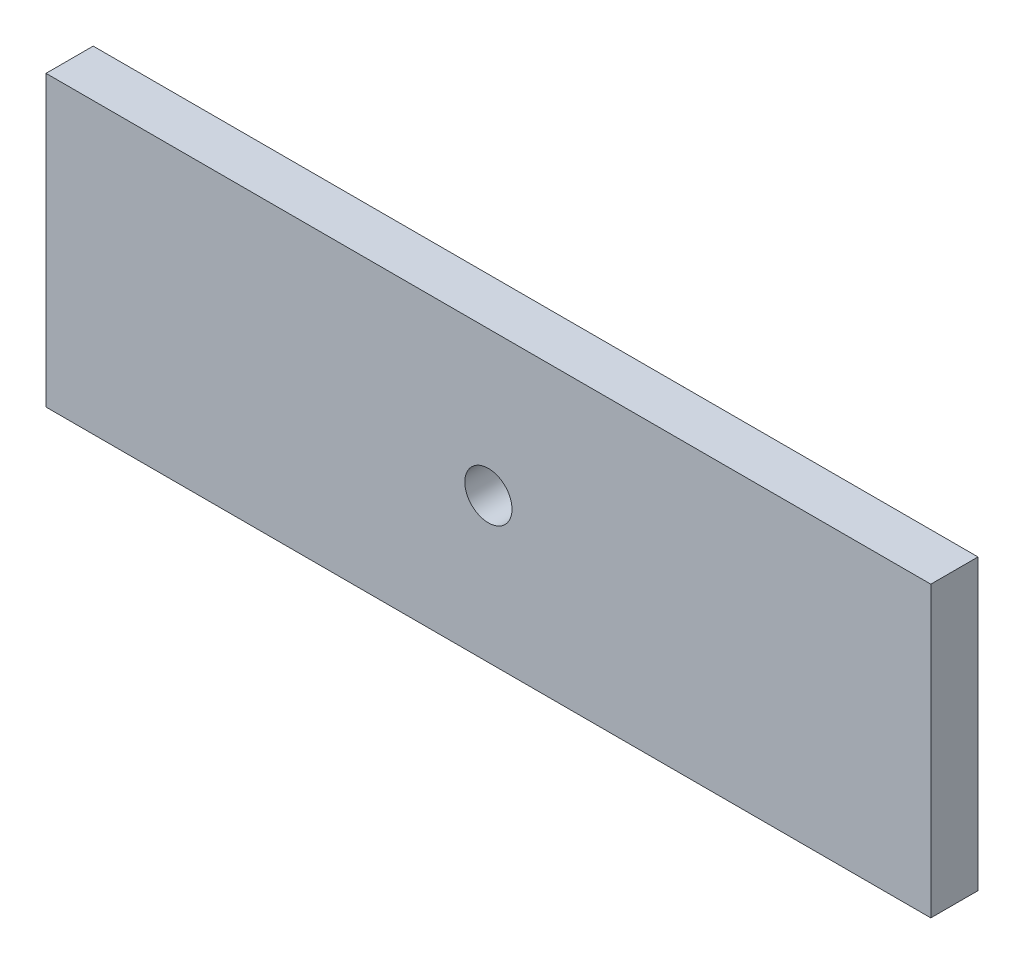
ISO-10303-21;
HEADER;
FILE_DESCRIPTION(('STEP AP214'),'2;1');
FILE_NAME('part.step','',(''),(''),'','','');
FILE_SCHEMA(('AUTOMOTIVE_DESIGN { 1 0 10303 214 1 1 1 1 }'));
ENDSEC;
DATA;
#1=APPLICATION_CONTEXT('core data for automotive mechanical design processes');
#2=APPLICATION_PROTOCOL_DEFINITION('international standard','automotive_design',2000,#1);
#3=PRODUCT_CONTEXT('',#1,'mechanical');
#4=PRODUCT('Part','Part','',(#3));
#5=PRODUCT_RELATED_PRODUCT_CATEGORY('part','',(#4));
#6=PRODUCT_DEFINITION_FORMATION('','',#4);
#7=PRODUCT_DEFINITION_CONTEXT('part definition',#1,'design');
#8=PRODUCT_DEFINITION('design','',#6,#7);
#9=PRODUCT_DEFINITION_SHAPE('','',#8);
#10=(LENGTH_UNIT() NAMED_UNIT(*) SI_UNIT(.MILLI.,.METRE.));
#11=(NAMED_UNIT(*) PLANE_ANGLE_UNIT() SI_UNIT($,.RADIAN.));
#12=(NAMED_UNIT(*) SI_UNIT($,.STERADIAN.) SOLID_ANGLE_UNIT());
#13=UNCERTAINTY_MEASURE_WITH_UNIT(LENGTH_MEASURE(1.E-05),#10,'distance_accuracy_value','');
#14=(GEOMETRIC_REPRESENTATION_CONTEXT(3) GLOBAL_UNCERTAINTY_ASSIGNED_CONTEXT((#13)) GLOBAL_UNIT_ASSIGNED_CONTEXT((#10,
#11,#12)) REPRESENTATION_CONTEXT('',''));
#15=CARTESIAN_POINT('',(0.,0.,0.));
#16=DIRECTION('',(0.,0.,1.));
#17=DIRECTION('',(1.,0.,0.));
#18=AXIS2_PLACEMENT_3D('',#15,#16,#17);
#19=CARTESIAN_POINT('',(-37.5,-12.25,4.));
#20=DIRECTION('',(0.,0.,-1.));
#21=DIRECTION('',(-1.,0.,0.));
#22=AXIS2_PLACEMENT_3D('',#19,#20,#21);
#23=PLANE('',#22);
#24=DIRECTION('',(0.,-1.,0.));
#25=VECTOR('',#24,1.);
#26=CARTESIAN_POINT('',(-37.5,12.25,4.));
#27=LINE('',#26,#25);
#28=CARTESIAN_POINT('',(-37.5,12.25,4.));
#29=VERTEX_POINT('',#28);
#30=CARTESIAN_POINT('',(-37.5,-12.25,4.));
#31=VERTEX_POINT('',#30);
#32=EDGE_CURVE('E82',#29,#31,#27,.T.);
#33=ORIENTED_EDGE('',*,*,#32,.T.);
#34=DIRECTION('',(1.,0.,0.));
#35=VECTOR('',#34,1.);
#36=CARTESIAN_POINT('',(37.5,-12.25,4.));
#37=LINE('',#36,#35);
#38=CARTESIAN_POINT('',(37.5,-12.25,4.));
#39=VERTEX_POINT('',#38);
#40=EDGE_CURVE('E77',#31,#39,#37,.T.);
#41=ORIENTED_EDGE('',*,*,#40,.T.);
#42=DIRECTION('',(0.,1.,0.));
#43=VECTOR('',#42,1.);
#44=CARTESIAN_POINT('',(37.5,12.25,4.));
#45=LINE('',#44,#43);
#46=CARTESIAN_POINT('',(37.5,12.25,4.));
#47=VERTEX_POINT('',#46);
#48=EDGE_CURVE('E80',#39,#47,#45,.T.);
#49=ORIENTED_EDGE('',*,*,#48,.T.);
#50=DIRECTION('',(-1.,0.,0.));
#51=VECTOR('',#50,1.);
#52=CARTESIAN_POINT('',(37.5,12.25,4.));
#53=LINE('',#52,#51);
#54=EDGE_CURVE('E47',#47,#29,#53,.T.);
#55=ORIENTED_EDGE('',*,*,#54,.T.);
#56=EDGE_LOOP('',(#33,#41,#49,#55));
#57=FACE_BOUND('',#56,.T.);
#58=CARTESIAN_POINT('',(0.,0.,4.));
#59=DIRECTION('',(0.,0.,1.));
#60=DIRECTION('',(1.,0.,0.));
#61=AXIS2_PLACEMENT_3D('',#58,#59,#60);
#62=CIRCLE('',#61,2.);
#63=CARTESIAN_POINT('',(2.00000000000001,0.,4.));
#64=VERTEX_POINT('',#63);
#65=EDGE_CURVE('E97',#64,#64,#62,.T.);
#66=ORIENTED_EDGE('',*,*,#65,.F.);
#67=EDGE_LOOP('',(#66));
#68=FACE_BOUND('',#67,.T.);
#69=ADVANCED_FACE('F30',(#57,#68),#23,.F.);
#70=CARTESIAN_POINT('',(-37.5,-12.25,0.));
#71=DIRECTION('',(0.,0.,-1.));
#72=DIRECTION('',(-1.,0.,0.));
#73=AXIS2_PLACEMENT_3D('',#70,#71,#72);
#74=PLANE('',#73);
#75=DIRECTION('',(0.,-1.,0.));
#76=VECTOR('',#75,1.);
#77=CARTESIAN_POINT('',(-37.5,12.25,0.));
#78=LINE('',#77,#76);
#79=CARTESIAN_POINT('',(-37.5,12.25,0.));
#80=VERTEX_POINT('',#79);
#81=CARTESIAN_POINT('',(-37.5,-12.25,0.));
#82=VERTEX_POINT('',#81);
#83=EDGE_CURVE('E94',#80,#82,#78,.T.);
#84=ORIENTED_EDGE('',*,*,#83,.F.);
#85=DIRECTION('',(-1.,0.,0.));
#86=VECTOR('',#85,1.);
#87=CARTESIAN_POINT('',(37.5,12.25,0.));
#88=LINE('',#87,#86);
#89=CARTESIAN_POINT('',(37.5,12.25,0.));
#90=VERTEX_POINT('',#89);
#91=EDGE_CURVE('E70',#90,#80,#88,.T.);
#92=ORIENTED_EDGE('',*,*,#91,.F.);
#93=DIRECTION('',(0.,1.,0.));
#94=VECTOR('',#93,1.);
#95=CARTESIAN_POINT('',(37.5,12.25,0.));
#96=LINE('',#95,#94);
#97=CARTESIAN_POINT('',(37.5,-12.25,0.));
#98=VERTEX_POINT('',#97);
#99=EDGE_CURVE('E64',#98,#90,#96,.T.);
#100=ORIENTED_EDGE('',*,*,#99,.F.);
#101=DIRECTION('',(1.,0.,0.));
#102=VECTOR('',#101,1.);
#103=CARTESIAN_POINT('',(37.5,-12.25,0.));
#104=LINE('',#103,#102);
#105=EDGE_CURVE('E86',#82,#98,#104,.T.);
#106=ORIENTED_EDGE('',*,*,#105,.F.);
#107=EDGE_LOOP('',(#84,#92,#100,#106));
#108=FACE_BOUND('',#107,.T.);
#109=CARTESIAN_POINT('',(0.,0.,0.));
#110=DIRECTION('',(0.,0.,1.));
#111=DIRECTION('',(1.,0.,0.));
#112=AXIS2_PLACEMENT_3D('',#109,#110,#111);
#113=CIRCLE('',#112,2.);
#114=CARTESIAN_POINT('',(2.00000000000001,0.,0.));
#115=VERTEX_POINT('',#114);
#116=EDGE_CURVE('E109',#115,#115,#113,.T.);
#117=ORIENTED_EDGE('',*,*,#116,.T.);
#118=EDGE_LOOP('',(#117));
#119=FACE_BOUND('',#118,.T.);
#120=ADVANCED_FACE('F105',(#108,#119),#74,.T.);
#121=CARTESIAN_POINT('',(-37.5,12.25,4.));
#122=DIRECTION('',(1.,0.,0.));
#123=DIRECTION('',(0.,0.,-1.));
#124=AXIS2_PLACEMENT_3D('',#121,#122,#123);
#125=PLANE('',#124);
#126=ORIENTED_EDGE('',*,*,#83,.T.);
#127=DIRECTION('',(0.,0.,-1.));
#128=VECTOR('',#127,1.);
#129=CARTESIAN_POINT('',(-37.5,-12.25,4.));
#130=LINE('',#129,#128);
#131=EDGE_CURVE('E11',#31,#82,#130,.T.);
#132=ORIENTED_EDGE('',*,*,#131,.F.);
#133=ORIENTED_EDGE('',*,*,#32,.F.);
#134=DIRECTION('',(0.,0.,-1.));
#135=VECTOR('',#134,1.);
#136=CARTESIAN_POINT('',(-37.5,12.25,4.));
#137=LINE('',#136,#135);
#138=EDGE_CURVE('E90',#29,#80,#137,.T.);
#139=ORIENTED_EDGE('',*,*,#138,.T.);
#140=EDGE_LOOP('',(#126,#132,#133,#139));
#141=FACE_BOUND('',#140,.T.);
#142=ADVANCED_FACE('F32',(#141),#125,.F.);
#143=CARTESIAN_POINT('',(37.5,-12.25,4.));
#144=DIRECTION('',(0.,1.,0.));
#145=DIRECTION('',(-1.,0.,0.));
#146=AXIS2_PLACEMENT_3D('',#143,#144,#145);
#147=PLANE('',#146);
#148=ORIENTED_EDGE('',*,*,#105,.T.);
#149=DIRECTION('',(0.,0.,-1.));
#150=VECTOR('',#149,1.);
#151=CARTESIAN_POINT('',(37.5,-12.25,4.));
#152=LINE('',#151,#150);
#153=EDGE_CURVE('E39',#39,#98,#152,.T.);
#154=ORIENTED_EDGE('',*,*,#153,.F.);
#155=ORIENTED_EDGE('',*,*,#40,.F.);
#156=ORIENTED_EDGE('',*,*,#131,.T.);
#157=EDGE_LOOP('',(#148,#154,#155,#156));
#158=FACE_BOUND('',#157,.T.);
#159=ADVANCED_FACE('F85',(#158),#147,.F.);
#160=CARTESIAN_POINT('',(37.5,12.25,4.));
#161=DIRECTION('',(-1.,0.,0.));
#162=DIRECTION('',(0.,0.,1.));
#163=AXIS2_PLACEMENT_3D('',#160,#161,#162);
#164=PLANE('',#163);
#165=ORIENTED_EDGE('',*,*,#99,.T.);
#166=DIRECTION('',(0.,0.,-1.));
#167=VECTOR('',#166,1.);
#168=CARTESIAN_POINT('',(37.5,12.25,4.));
#169=LINE('',#168,#167);
#170=EDGE_CURVE('E87',#47,#90,#169,.T.);
#171=ORIENTED_EDGE('',*,*,#170,.F.);
#172=ORIENTED_EDGE('',*,*,#48,.F.);
#173=ORIENTED_EDGE('',*,*,#153,.T.);
#174=EDGE_LOOP('',(#165,#171,#172,#173));
#175=FACE_BOUND('',#174,.T.);
#176=ADVANCED_FACE('F88',(#175),#164,.F.);
#177=CARTESIAN_POINT('',(37.5,12.25,4.));
#178=DIRECTION('',(0.,-1.,0.));
#179=DIRECTION('',(1.,0.,0.));
#180=AXIS2_PLACEMENT_3D('',#177,#178,#179);
#181=PLANE('',#180);
#182=ORIENTED_EDGE('',*,*,#91,.T.);
#183=ORIENTED_EDGE('',*,*,#138,.F.);
#184=ORIENTED_EDGE('',*,*,#54,.F.);
#185=ORIENTED_EDGE('',*,*,#170,.T.);
#186=EDGE_LOOP('',(#182,#183,#184,#185));
#187=FACE_BOUND('',#186,.T.);
#188=ADVANCED_FACE('F102',(#187),#181,.F.);
#189=CARTESIAN_POINT('',(0.,0.,4.));
#190=DIRECTION('',(0.,0.,-1.));
#191=DIRECTION('',(-1.,0.,0.));
#192=AXIS2_PLACEMENT_3D('',#189,#190,#191);
#193=CYLINDRICAL_SURFACE('',#192,2.);
#194=ORIENTED_EDGE('',*,*,#65,.T.);
#195=EDGE_LOOP('',(#194));
#196=FACE_BOUND('',#195,.T.);
#197=ORIENTED_EDGE('',*,*,#116,.F.);
#198=EDGE_LOOP('',(#197));
#199=FACE_BOUND('',#198,.T.);
#200=ADVANCED_FACE('F115',(#196,#199),#193,.F.);
#201=CLOSED_SHELL('',(#69,#120,#142,#159,#176,#188,#200));
#202=MANIFOLD_SOLID_BREP('B2',#201);
#203=ADVANCED_BREP_SHAPE_REPRESENTATION('',(#18,#202),#14);
#204=SHAPE_DEFINITION_REPRESENTATION(#9,#203);
ENDSEC;
END-ISO-10303-21;
